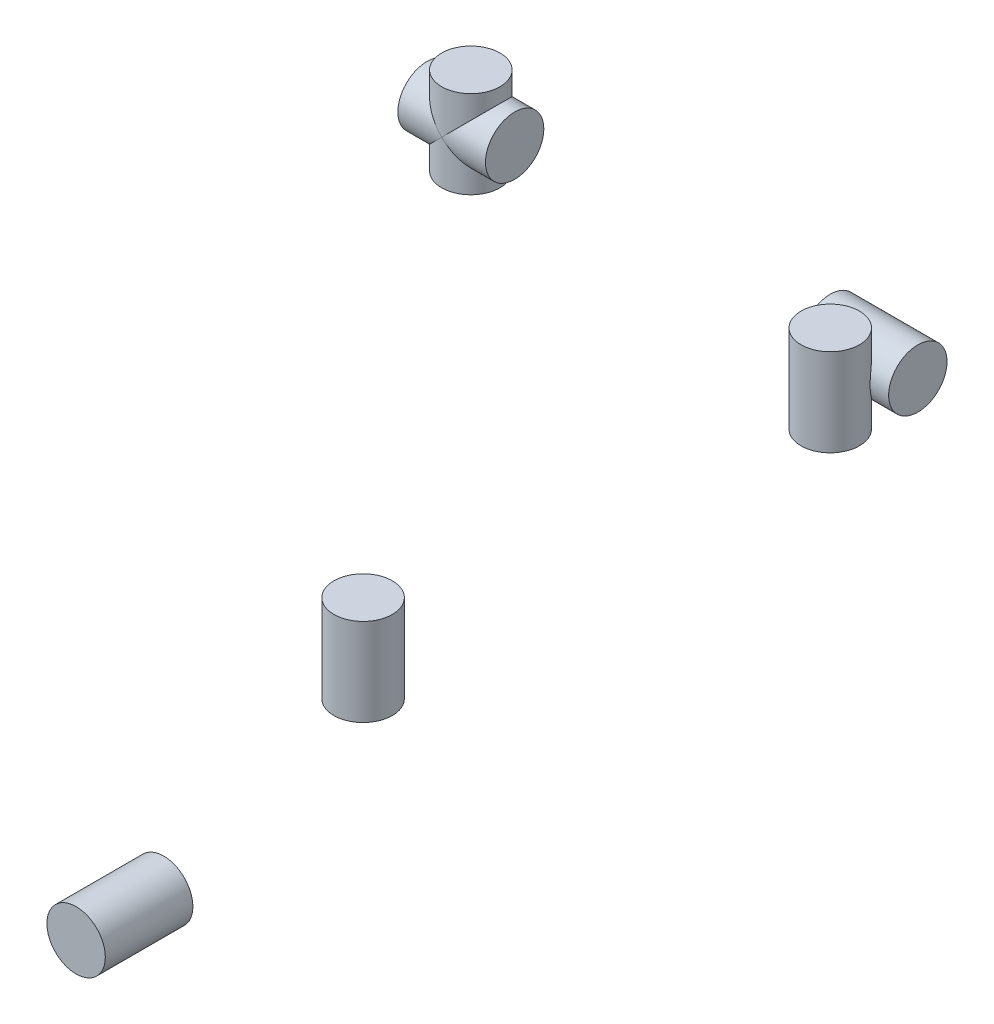
ISO-10303-21;
HEADER;
FILE_DESCRIPTION(('STEP AP214'),'2;1');
FILE_NAME('part.step','',(''),(''),'','','');
FILE_SCHEMA(('AUTOMOTIVE_DESIGN { 1 0 10303 214 1 1 1 1 }'));
ENDSEC;
DATA;
#1=APPLICATION_CONTEXT('core data for automotive mechanical design processes');
#2=APPLICATION_PROTOCOL_DEFINITION('international standard','automotive_design',2000,#1);
#3=PRODUCT_CONTEXT('',#1,'mechanical');
#4=PRODUCT('Part','Part','',(#3));
#5=PRODUCT_RELATED_PRODUCT_CATEGORY('part','',(#4));
#6=PRODUCT_DEFINITION_FORMATION('','',#4);
#7=PRODUCT_DEFINITION_CONTEXT('part definition',#1,'design');
#8=PRODUCT_DEFINITION('design','',#6,#7);
#9=PRODUCT_DEFINITION_SHAPE('','',#8);
#10=(LENGTH_UNIT() NAMED_UNIT(*) SI_UNIT(.MILLI.,.METRE.));
#11=(NAMED_UNIT(*) PLANE_ANGLE_UNIT() SI_UNIT($,.RADIAN.));
#12=(NAMED_UNIT(*) SI_UNIT($,.STERADIAN.) SOLID_ANGLE_UNIT());
#13=UNCERTAINTY_MEASURE_WITH_UNIT(LENGTH_MEASURE(1.E-05),#10,'distance_accuracy_value','');
#14=(GEOMETRIC_REPRESENTATION_CONTEXT(3) GLOBAL_UNCERTAINTY_ASSIGNED_CONTEXT((#13)) GLOBAL_UNIT_ASSIGNED_CONTEXT((#10,
#11,#12)) REPRESENTATION_CONTEXT('',''));
#15=CARTESIAN_POINT('',(0.,0.,0.));
#16=DIRECTION('',(0.,0.,1.));
#17=DIRECTION('',(1.,0.,0.));
#18=AXIS2_PLACEMENT_3D('',#15,#16,#17);
#19=CARTESIAN_POINT('',(-175.6,-15.,-310.8));
#20=DIRECTION('',(0.,1.,0.));
#21=DIRECTION('',(0.,0.,1.));
#22=AXIS2_PLACEMENT_3D('',#19,#20,#21);
#23=CYLINDRICAL_SURFACE('',#22,10.);
#24=CARTESIAN_POINT('',(-175.6,0.,-310.8));
#25=DIRECTION('',(0.707106781186547,0.707106781186547,0.));
#26=DIRECTION('',(-0.707106781186547,0.707106781186547,0.));
#27=AXIS2_PLACEMENT_3D('',#24,#25,#26);
#28=ELLIPSE('',#27,14.1421356237309,9.99999999999999);
#29=CARTESIAN_POINT('',(-175.6,0.,-300.8));
#30=VERTEX_POINT('',#29);
#31=CARTESIAN_POINT('',(-175.6,0.,-320.8));
#32=VERTEX_POINT('',#31);
#33=EDGE_CURVE('E58',#30,#32,#28,.T.);
#34=ORIENTED_EDGE('',*,*,#33,.F.);
#35=CARTESIAN_POINT('',(-175.6,0.,-310.8));
#36=DIRECTION('',(-0.707106781186547,0.707106781186547,0.));
#37=DIRECTION('',(0.707106781186547,0.707106781186547,0.));
#38=AXIS2_PLACEMENT_3D('',#35,#36,#37);
#39=ELLIPSE('',#38,14.1421356237309,9.99999999999999);
#40=EDGE_CURVE('E70',#32,#30,#39,.T.);
#41=ORIENTED_EDGE('',*,*,#40,.F.);
#42=EDGE_LOOP('',(#34,#41));
#43=FACE_BOUND('',#42,.T.);
#44=CARTESIAN_POINT('',(-175.6,-15.,-310.8));
#45=DIRECTION('',(0.,1.,0.));
#46=DIRECTION('',(0.,0.,1.));
#47=AXIS2_PLACEMENT_3D('',#44,#45,#46);
#48=CIRCLE('',#47,10.);
#49=CARTESIAN_POINT('',(-175.6,-15.,-300.8));
#50=VERTEX_POINT('',#49);
#51=EDGE_CURVE('E89',#50,#50,#48,.T.);
#52=ORIENTED_EDGE('',*,*,#51,.T.);
#53=EDGE_LOOP('',(#52));
#54=FACE_BOUND('',#53,.T.);
#55=ADVANCED_FACE('F50',(#43,#54),#23,.T.);
#56=CARTESIAN_POINT('',(-175.6,-15.,-310.8));
#57=DIRECTION('',(0.,1.,0.));
#58=DIRECTION('',(0.,0.,1.));
#59=AXIS2_PLACEMENT_3D('',#56,#57,#58);
#60=PLANE('',#59);
#61=ORIENTED_EDGE('',*,*,#51,.F.);
#62=EDGE_LOOP('',(#61));
#63=FACE_BOUND('',#62,.T.);
#64=ADVANCED_FACE('F106',(#63),#60,.F.);
#65=CARTESIAN_POINT('',(-160.6,0.,-310.8));
#66=DIRECTION('',(1.,0.,0.));
#67=DIRECTION('',(0.,0.,-1.));
#68=AXIS2_PLACEMENT_3D('',#65,#66,#67);
#69=PLANE('',#68);
#70=CARTESIAN_POINT('',(-160.6,0.,-310.8));
#71=DIRECTION('',(1.,0.,0.));
#72=DIRECTION('',(0.,0.,-1.));
#73=AXIS2_PLACEMENT_3D('',#70,#71,#72);
#74=CIRCLE('',#73,9.99999999999998);
#75=CARTESIAN_POINT('',(-160.6,0.,-320.8));
#76=VERTEX_POINT('',#75);
#77=EDGE_CURVE('E90',#76,#76,#74,.T.);
#78=ORIENTED_EDGE('',*,*,#77,.T.);
#79=EDGE_LOOP('',(#78));
#80=FACE_BOUND('',#79,.T.);
#81=ADVANCED_FACE('F110',(#80),#69,.T.);
#82=CARTESIAN_POINT('',(-190.6,0.,-310.8));
#83=DIRECTION('',(1.,0.,0.));
#84=DIRECTION('',(0.,0.,-1.));
#85=AXIS2_PLACEMENT_3D('',#82,#83,#84);
#86=CYLINDRICAL_SURFACE('',#85,9.99999999999998);
#87=ORIENTED_EDGE('',*,*,#77,.F.);
#88=EDGE_LOOP('',(#87));
#89=FACE_BOUND('',#88,.T.);
#90=CARTESIAN_POINT('',(-175.6,0.,-310.8));
#91=DIRECTION('',(-0.707106781186547,0.707106781186547,0.));
#92=DIRECTION('',(0.707106781186547,0.707106781186547,0.));
#93=AXIS2_PLACEMENT_3D('',#90,#91,#92);
#94=ELLIPSE('',#93,14.1421356237309,9.99999999999999);
#95=EDGE_CURVE('E64',#32,#30,#94,.F.);
#96=ORIENTED_EDGE('',*,*,#95,.T.);
#97=ORIENTED_EDGE('',*,*,#33,.T.);
#98=EDGE_LOOP('',(#96,#97));
#99=FACE_BOUND('',#98,.T.);
#100=ADVANCED_FACE('F79',(#89,#99),#86,.T.);
#101=CARTESIAN_POINT('',(-175.6,15.,-310.8));
#102=DIRECTION('',(0.,1.,0.));
#103=DIRECTION('',(0.,0.,1.));
#104=AXIS2_PLACEMENT_3D('',#101,#102,#103);
#105=PLANE('',#104);
#106=CARTESIAN_POINT('',(-175.6,15.,-310.8));
#107=DIRECTION('',(0.,1.,0.));
#108=DIRECTION('',(0.,0.,1.));
#109=AXIS2_PLACEMENT_3D('',#106,#107,#108);
#110=CIRCLE('',#109,10.);
#111=CARTESIAN_POINT('',(-175.6,15.,-300.8));
#112=VERTEX_POINT('',#111);
#113=EDGE_CURVE('E77',#112,#112,#110,.T.);
#114=ORIENTED_EDGE('',*,*,#113,.T.);
#115=EDGE_LOOP('',(#114));
#116=FACE_BOUND('',#115,.T.);
#117=ADVANCED_FACE('F52',(#116),#105,.T.);
#118=CARTESIAN_POINT('',(-175.6,0.,-310.8));
#119=DIRECTION('',(0.707106781186547,0.707106781186547,0.));
#120=DIRECTION('',(-0.707106781186547,0.707106781186547,0.));
#121=AXIS2_PLACEMENT_3D('',#118,#119,#120);
#122=ELLIPSE('',#121,14.1421356237309,9.99999999999999);
#123=EDGE_CURVE('E12',#30,#32,#122,.F.);
#124=ORIENTED_EDGE('',*,*,#123,.F.);
#125=ORIENTED_EDGE('',*,*,#95,.F.);
#126=EDGE_LOOP('',(#124,#125));
#127=FACE_BOUND('',#126,.T.);
#128=ORIENTED_EDGE('',*,*,#113,.F.);
#129=EDGE_LOOP('',(#128));
#130=FACE_BOUND('',#129,.T.);
#131=ADVANCED_FACE('F75',(#127,#130),#23,.T.);
#132=ORIENTED_EDGE('',*,*,#40,.T.);
#133=ORIENTED_EDGE('',*,*,#123,.T.);
#134=EDGE_LOOP('',(#132,#133));
#135=FACE_BOUND('',#134,.T.);
#136=CARTESIAN_POINT('',(-190.6,0.,-310.8));
#137=DIRECTION('',(1.,0.,0.));
#138=DIRECTION('',(0.,0.,-1.));
#139=AXIS2_PLACEMENT_3D('',#136,#137,#138);
#140=CIRCLE('',#139,9.99999999999998);
#141=CARTESIAN_POINT('',(-190.6,0.,-320.8));
#142=VERTEX_POINT('',#141);
#143=EDGE_CURVE('E87',#142,#142,#140,.T.);
#144=ORIENTED_EDGE('',*,*,#143,.T.);
#145=EDGE_LOOP('',(#144));
#146=FACE_BOUND('',#145,.T.);
#147=ADVANCED_FACE('F80',(#135,#146),#86,.T.);
#148=CARTESIAN_POINT('',(-190.6,0.,-310.8));
#149=DIRECTION('',(1.,0.,0.));
#150=DIRECTION('',(0.,0.,-1.));
#151=AXIS2_PLACEMENT_3D('',#148,#149,#150);
#152=PLANE('',#151);
#153=ORIENTED_EDGE('',*,*,#143,.F.);
#154=EDGE_LOOP('',(#153));
#155=FACE_BOUND('',#154,.T.);
#156=ADVANCED_FACE('F83',(#155),#152,.F.);
#157=CLOSED_SHELL('',(#55,#64,#81,#100,#117,#131,#147,#156));
#158=MANIFOLD_SOLID_BREP('B2',#157);
#159=CARTESIAN_POINT('',(-37.5,-15.,-295.8));
#160=DIRECTION('',(0.,1.,0.));
#161=DIRECTION('',(0.,0.,1.));
#162=AXIS2_PLACEMENT_3D('',#159,#160,#161);
#163=CYLINDRICAL_SURFACE('',#162,10.);
#164=CARTESIAN_POINT('',(-37.5,-8.66025403784436,-305.8));
#165=CARTESIAN_POINT('',(-37.7339230049075,-8.66025272050397,-305.800001345728));
#166=CARTESIAN_POINT('',(-37.9678254000365,-8.65552632143993,-305.791785374895));
#167=CARTESIAN_POINT('',(-38.4341657311689,-8.63648280066919,-305.759014630741));
#168=CARTESIAN_POINT('',(-38.6666032654161,-8.62216315436562,-305.734455556516));
#169=CARTESIAN_POINT('',(-39.1286690070044,-8.58351686023801,-305.669242406504));
#170=CARTESIAN_POINT('',(-39.3582933370168,-8.55917771872431,-305.628568238581));
#171=CARTESIAN_POINT('',(-39.8128233452028,-8.49986003102336,-305.531641004278));
#172=CARTESIAN_POINT('',(-40.0377293518527,-8.46488222811425,-305.475389026278));
#173=CARTESIAN_POINT('',(-40.4816949259291,-8.38335582886692,-305.347928998677));
#174=CARTESIAN_POINT('',(-40.7007401049489,-8.33678121675396,-305.276687378427));
#175=CARTESIAN_POINT('',(-41.1307566379394,-8.23110468231337,-305.120404211809));
#176=CARTESIAN_POINT('',(-41.3417278358337,-8.17200251796248,-305.03536239884));
#177=CARTESIAN_POINT('',(-41.7537044424931,-8.04025833414602,-304.852993904218));
#178=CARTESIAN_POINT('',(-41.9547177081432,-7.96762721168677,-304.755677129755));
#179=CARTESIAN_POINT('',(-42.3452618303735,-7.8077675591746,-304.550547216069));
#180=CARTESIAN_POINT('',(-42.5347934199239,-7.72053996227562,-304.44273474802));
#181=CARTESIAN_POINT('',(-42.8932090425681,-7.53456128770079,-304.223513901636));
#182=CARTESIAN_POINT('',(-43.0626233840807,-7.43643811182972,-304.112440065686));
#183=CARTESIAN_POINT('',(-43.3882546000434,-7.22546781356393,-303.885041246825));
#184=CARTESIAN_POINT('',(-43.5444718627111,-7.11262112453864,-303.768716418538));
#185=CARTESIAN_POINT('',(-43.8427191201456,-6.87206591762845,-303.533433101581));
#186=CARTESIAN_POINT('',(-43.9847544304312,-6.74436300713533,-303.414475620231));
#187=CARTESIAN_POINT('',(-44.254116586128,-6.4742653208274,-303.176598197734));
#188=CARTESIAN_POINT('',(-44.3814441551966,-6.3318712685064,-303.057678255027));
#189=CARTESIAN_POINT('',(-44.6123435466863,-6.04403535742714,-302.831270502152));
#190=CARTESIAN_POINT('',(-44.716975275097,-5.89959500597967,-302.723586955216));
#191=CARTESIAN_POINT('',(-44.9136066939399,-5.59936992729039,-302.512617474542));
#192=CARTESIAN_POINT('',(-45.0056070633257,-5.44358581048167,-302.409331304644));
#193=CARTESIAN_POINT('',(-45.1773867069789,-5.12157403202801,-302.208990406547));
#194=CARTESIAN_POINT('',(-45.2571632419013,-4.95534404121154,-302.111937077943));
#195=CARTESIAN_POINT('',(-45.4050518241694,-4.61354802854454,-301.925708166565));
#196=CARTESIAN_POINT('',(-45.4731634101421,-4.43798163777962,-301.836532895453));
#197=CARTESIAN_POINT('',(-45.5997910060612,-4.07473086795931,-301.665573723609));
#198=CARTESIAN_POINT('',(-45.6580632954663,-3.88686498890024,-301.583995281056));
#199=CARTESIAN_POINT('',(-45.7639403354064,-3.50388101323964,-301.43168677257));
#200=CARTESIAN_POINT('',(-45.8115450181917,-3.30876287058835,-301.360956775536));
#201=CARTESIAN_POINT('',(-45.8968732704893,-2.91249532380806,-301.231256754626));
#202=CARTESIAN_POINT('',(-45.9345941540546,-2.71134429674413,-301.172289928457));
#203=CARTESIAN_POINT('',(-46.0008381325733,-2.30431086989732,-301.066842238457));
#204=CARTESIAN_POINT('',(-46.0293607784339,-2.09842823962525,-301.020361984286));
#205=CARTESIAN_POINT('',(-46.0798432407944,-1.66554390750987,-300.937010041516));
#206=CARTESIAN_POINT('',(-46.1010417544487,-1.43823141623587,-300.901286890378));
#207=CARTESIAN_POINT('',(-46.1338447383416,-0.980998847598446,-300.845569153776));
#208=CARTESIAN_POINT('',(-46.1454487179724,-0.751078637501008,-300.825575372622));
#209=CARTESIAN_POINT('',(-46.1593752352375,-0.290040943514111,-300.801541259551));
#210=CARTESIAN_POINT('',(-46.161694363079,-0.0589230509780367,-300.797506788579));
#211=CARTESIAN_POINT('',(-46.1571049755177,0.402947281533959,-300.805452247095));
#212=CARTESIAN_POINT('',(-46.1501962845222,0.63369971447203,-300.81743248132));
#213=CARTESIAN_POINT('',(-46.126383146783,1.10484829089289,-300.858271226891));
#214=CARTESIAN_POINT('',(-46.1089965657517,1.34515028950072,-300.887943058158));
#215=CARTESIAN_POINT('',(-46.0633392470013,1.82197916296547,-300.964416803553));
#216=CARTESIAN_POINT('',(-46.035068047335,2.05850587715414,-301.011219444715));
#217=CARTESIAN_POINT('',(-45.9668687614415,2.52598227549846,-301.121308494536));
#218=CARTESIAN_POINT('',(-45.9269409336852,2.75693208319202,-301.184594537692));
#219=CARTESIAN_POINT('',(-45.8344369339235,3.21140813527477,-301.32669374471));
#220=CARTESIAN_POINT('',(-45.7818612724379,3.43493467888391,-301.405506281834));
#221=CARTESIAN_POINT('',(-45.664175699868,3.86808035141751,-301.575525003922));
#222=CARTESIAN_POINT('',(-45.5993524454655,4.07789303789492,-301.666435897969));
#223=CARTESIAN_POINT('',(-45.4553900218682,4.48682645387963,-301.860225173449));
#224=CARTESIAN_POINT('',(-45.3762510003086,4.68594729362204,-301.963103431461));
#225=CARTESIAN_POINT('',(-45.2027137731209,5.07161454595842,-302.178661062545));
#226=CARTESIAN_POINT('',(-45.1083285819945,5.25817149263092,-302.291332038751));
#227=CARTESIAN_POINT('',(-44.9034604251157,5.61732540437465,-302.524045020968));
#228=CARTESIAN_POINT('',(-44.7929790200805,5.78992372037888,-302.644086311686));
#229=CARTESIAN_POINT('',(-44.5653234287948,6.10621603101423,-302.878533809271));
#230=CARTESIAN_POINT('',(-44.4494606642816,6.25111999464351,-302.992583721724));
#231=CARTESIAN_POINT('',(-44.2038239918847,6.52740963722448,-303.222060239159));
#232=CARTESIAN_POINT('',(-44.0740509124941,6.65879612035963,-303.337486761787));
#233=CARTESIAN_POINT('',(-43.8009445940581,6.90766180711926,-303.567234428351));
#234=CARTESIAN_POINT('',(-43.6576127527879,7.02514244149509,-303.681555684892));
#235=CARTESIAN_POINT('',(-43.3580457799208,7.24618185436346,-303.906688434725));
#236=CARTESIAN_POINT('',(-43.2018107330227,7.34974072422917,-304.017499951048));
#237=CARTESIAN_POINT('',(-42.8851687575964,7.53859137126236,-304.228189342588));
#238=CARTESIAN_POINT('',(-42.7253199197729,7.62452044420666,-304.328336688668));
#239=CARTESIAN_POINT('',(-42.3957947489366,7.78449956203914,-304.521678901559));
#240=CARTESIAN_POINT('',(-42.2261187997451,7.85855007044751,-304.614874039581));
#241=CARTESIAN_POINT('',(-41.8779983564331,7.99542159007013,-304.792850430731));
#242=CARTESIAN_POINT('',(-41.6995516072528,8.05823969386263,-304.877629502906));
#243=CARTESIAN_POINT('',(-41.3350892563678,8.17333970856684,-305.037515765242));
#244=CARTESIAN_POINT('',(-41.1490732732266,8.22562108770882,-305.112622467186));
#245=CARTESIAN_POINT('',(-40.759970683345,8.32305277618827,-305.256107931025));
#246=CARTESIAN_POINT('',(-40.5565131955046,8.36763394791899,-305.323867578633));
#247=CARTESIAN_POINT('',(-40.1438538419111,8.44666520804767,-305.446573617107));
#248=CARTESIAN_POINT('',(-39.9346518111309,8.48111500506159,-305.501519639436));
#249=CARTESIAN_POINT('',(-39.5117880593158,8.54060009031652,-305.597946314622));
#250=CARTESIAN_POINT('',(-39.2981249876896,8.56563248247846,-305.639422824743));
#251=CARTESIAN_POINT('',(-38.867712958196,8.60682696627153,-305.70842440226));
#252=CARTESIAN_POINT('',(-38.6509638744144,8.62298869489505,-305.735948898705));
#253=CARTESIAN_POINT('',(-38.1980845445137,8.64778622796511,-305.77840095217));
#254=CARTESIAN_POINT('',(-37.9618021204518,8.65570923876767,-305.792132349482));
#255=CARTESIAN_POINT('',(-37.4887256090772,8.661867778497,-305.802792625764));
#256=CARTESIAN_POINT('',(-37.2519314951735,8.66010279124599,-305.799720609446));
#257=CARTESIAN_POINT('',(-36.779346665121,8.64683114966977,-305.776805064483));
#258=CARTESIAN_POINT('',(-36.5435563137693,8.63532121461572,-305.756955887652));
#259=CARTESIAN_POINT('',(-36.0746672016468,8.60223036724155,-305.700716200926));
#260=CARTESIAN_POINT('',(-35.8415684471313,8.58064943152102,-305.664325652596));
#261=CARTESIAN_POINT('',(-35.3736903450363,8.52613298092633,-305.574303904359));
#262=CARTESIAN_POINT('',(-35.139024803484,8.49291690756839,-305.520249155313));
#263=CARTESIAN_POINT('',(-34.6760645877623,8.4143902930732,-305.395979823944));
#264=CARTESIAN_POINT('',(-34.4477700978479,8.36907940254529,-305.325764774795));
#265=CARTESIAN_POINT('',(-33.9995193154378,8.26531405255152,-305.170319051776));
#266=CARTESIAN_POINT('',(-33.7795597636896,8.20686479393958,-305.085094322405));
#267=CARTESIAN_POINT('',(-33.3497975381789,8.07564267448487,-304.901122893773));
#268=CARTESIAN_POINT('',(-33.1399941461838,8.00287082836908,-304.8023771526));
#269=CARTESIAN_POINT('',(-32.7421498158752,7.84569540581204,-304.598320024501));
#270=CARTESIAN_POINT('',(-32.5535481211911,7.76201278292608,-304.493546961413));
#271=CARTESIAN_POINT('',(-32.1887835260794,7.57974992715258,-304.275618422095));
#272=CARTESIAN_POINT('',(-32.0126201950716,7.48117021033091,-304.162463236308));
#273=CARTESIAN_POINT('',(-31.6742022893101,7.26858199208275,-303.930323505587));
#274=CARTESIAN_POINT('',(-31.5119376696881,7.15458478949521,-303.811343269953));
#275=CARTESIAN_POINT('',(-31.2022369683836,6.9108600323997,-303.57024395007));
#276=CARTESIAN_POINT('',(-31.0547997687636,6.78113366544697,-303.448125103334));
#277=CARTESIAN_POINT('',(-30.7873515232728,6.51787985758211,-303.214121209191));
#278=CARTESIAN_POINT('',(-30.6660736948783,6.3856216696194,-303.102252224595));
#279=CARTESIAN_POINT('',(-30.4366740883947,6.10856230377373,-302.880598008506));
#280=CARTESIAN_POINT('',(-30.3285515015063,5.96376189793863,-302.770812649261));
#281=CARTESIAN_POINT('',(-30.1253380135851,5.66232632004536,-302.555463967687));
#282=CARTESIAN_POINT('',(-30.0302491129528,5.5056893370284,-302.449901295209));
#283=CARTESIAN_POINT('',(-29.8527433422361,5.18155431421262,-302.244986367407));
#284=CARTESIAN_POINT('',(-29.7703267791611,5.01405601141938,-302.145634262578));
#285=CARTESIAN_POINT('',(-29.61831925828,4.67097774181715,-301.955790803771));
#286=CARTESIAN_POINT('',(-29.5486126647635,4.49549090156896,-301.86522347769));
#287=CARTESIAN_POINT('',(-29.4203628889269,4.13614172519379,-301.693298805767));
#288=CARTESIAN_POINT('',(-29.3618195476845,3.95227950834653,-301.611941328818));
#289=CARTESIAN_POINT('',(-29.255129235387,3.57734236402686,-301.459572643903));
#290=CARTESIAN_POINT('',(-29.206984912435,3.38626561389705,-301.388564072774));
#291=CARTESIAN_POINT('',(-29.120367299359,2.99815382571509,-301.257829715742));
#292=CARTESIAN_POINT('',(-29.081894512448,2.80111847823262,-301.198104516958));
#293=CARTESIAN_POINT('',(-29.0112819421318,2.38667225850145,-301.086433087113));
#294=CARTESIAN_POINT('',(-28.9798734754784,2.16887362036716,-301.035461521952));
#295=CARTESIAN_POINT('',(-28.926799727248,1.7292052164569,-300.948091771705));
#296=CARTESIAN_POINT('',(-28.9051348780934,1.50733527045071,-300.911694233424));
#297=CARTESIAN_POINT('',(-28.8710145500088,1.06087324480816,-300.853883540738));
#298=CARTESIAN_POINT('',(-28.8585623040001,0.836280237659802,-300.832475646696));
#299=CARTESIAN_POINT('',(-28.8425616959292,0.385844012678835,-300.80489896692));
#300=CARTESIAN_POINT('',(-28.8390135987042,0.160000757860174,-300.798730634457));
#301=CARTESIAN_POINT('',(-28.8407848300795,-0.306487107361437,-300.801800291783));
#302=CARTESIAN_POINT('',(-28.8467057046679,-0.547123481090264,-300.812083428211));
#303=CARTESIAN_POINT('',(-28.8687356415912,-1.02657560470252,-300.849925921081));
#304=CARTESIAN_POINT('',(-28.8848452057615,-1.26539126432179,-300.87748612849));
#305=CARTESIAN_POINT('',(-28.9277209214889,-1.73953928261719,-300.949542612539));
#306=CARTESIAN_POINT('',(-28.9544891041283,-1.97487096852518,-300.994042117023));
#307=CARTESIAN_POINT('',(-29.0194090728331,-2.44025354433115,-301.099377569241));
#308=CARTESIAN_POINT('',(-29.0575606401045,-2.67030453563497,-301.160213202986));
#309=CARTESIAN_POINT('',(-29.1461963189732,-3.12333889800753,-301.297328862791));
#310=CARTESIAN_POINT('',(-29.1966807219318,-3.34632210196023,-301.373609253724));
#311=CARTESIAN_POINT('',(-29.31108169894,-3.78337524172568,-301.540368810418));
#312=CARTESIAN_POINT('',(-29.3749983935535,-3.99744509751437,-301.630848103622));
#313=CARTESIAN_POINT('',(-29.5173640766211,-4.41466217181216,-301.824277928142));
#314=CARTESIAN_POINT('',(-29.5958025516057,-4.61781715604516,-301.927219418542));
#315=CARTESIAN_POINT('',(-29.7683164590508,-5.01155772001925,-302.143515351581));
#316=CARTESIAN_POINT('',(-29.8623904178079,-5.20214448200034,-302.256868812404));
#317=CARTESIAN_POINT('',(-30.0597758623762,-5.55610510290199,-302.483110399978));
#318=CARTESIAN_POINT('',(-30.1619609317574,-5.72045030068174,-302.595462691436));
#319=CARTESIAN_POINT('',(-30.3809771004374,-6.03577031129951,-302.824572014275));
#320=CARTESIAN_POINT('',(-30.4978074398021,-6.18674581718951,-302.941328816887));
#321=CARTESIAN_POINT('',(-30.746123741549,-6.47444710604032,-303.176610798348));
#322=CARTESIAN_POINT('',(-30.8776031029407,-6.61117925388121,-303.29513516003));
#323=CARTESIAN_POINT('',(-31.1549407319873,-6.87001180872867,-303.531324724518));
#324=CARTESIAN_POINT('',(-31.3007984519936,-6.99211277262139,-303.648989959862));
#325=CARTESIAN_POINT('',(-31.5953889352225,-7.21349441859743,-303.872627506094));
#326=CARTESIAN_POINT('',(-31.7431893304017,-7.31377818222637,-303.978838351056));
#327=CARTESIAN_POINT('',(-32.0497957136244,-7.50187864668271,-304.18627003306));
#328=CARTESIAN_POINT('',(-32.2086011564633,-7.58969596445813,-304.287491116877));
#329=CARTESIAN_POINT('',(-32.5363214843966,-7.75336102091788,-304.48322198333));
#330=CARTESIAN_POINT('',(-32.7052415649646,-7.82920253410629,-304.577728261397));
#331=CARTESIAN_POINT('',(-33.0520140055885,-7.96948217600836,-304.758440304904));
#332=CARTESIAN_POINT('',(-33.2298666230421,-8.03391997587317,-304.844645830944));
#333=CARTESIAN_POINT('',(-33.5989113764543,-8.15391710914246,-305.009974632477));
#334=CARTESIAN_POINT('',(-33.7903453678725,-8.20914337179983,-305.088799456937));
#335=CARTESIAN_POINT('',(-34.1801622768809,-8.30904830970512,-305.235148770637));
#336=CARTESIAN_POINT('',(-34.3785456877564,-8.3537262344591,-305.302672455724));
#337=CARTESIAN_POINT('',(-34.7808109955109,-8.43327204935607,-305.425497495274));
#338=CARTESIAN_POINT('',(-34.9846887074303,-8.46814718698329,-305.480807872869));
#339=CARTESIAN_POINT('',(-35.3967634503603,-8.52879863740412,-305.578611846735));
#340=CARTESIAN_POINT('',(-35.6049596756509,-8.55457663160094,-305.621107811252));
#341=CARTESIAN_POINT('',(-36.0919503164424,-8.60451088943874,-305.704364269852));
#342=CARTESIAN_POINT('',(-36.3719343349395,-8.62548472322001,-305.740179806104));
#343=CARTESIAN_POINT('',(-36.9346221762054,-8.6533574491632,-305.787997460064));
#344=CARTESIAN_POINT('',(-37.2173261357558,-8.66025562972585,-305.799998373815));
#345=CARTESIAN_POINT('',(-37.5,-8.66025403784436,-305.8));
#346=B_SPLINE_CURVE_WITH_KNOTS('',3,(#164,#165,#166,#167,#168,#169,#170,#171,#172,#173,#174,
#175,#176,#177,#178,#179,#180,#181,#182,#183,#184,#185,#186,#187,#188,#189,#190,#191,#192,#193,
#194,#195,#196,#197,#198,#199,#200,#201,#202,#203,#204,#205,#206,#207,#208,#209,#210,#211,#212,
#213,#214,#215,#216,#217,#218,#219,#220,#221,#222,#223,#224,#225,#226,#227,#228,#229,#230,#231,
#232,#233,#234,#235,#236,#237,#238,#239,#240,#241,#242,#243,#244,#245,#246,#247,#248,#249,#250,
#251,#252,#253,#254,#255,#256,#257,#258,#259,#260,#261,#262,#263,#264,#265,#266,#267,#268,#269,
#270,#271,#272,#273,#274,#275,#276,#277,#278,#279,#280,#281,#282,#283,#284,#285,#286,#287,#288,
#289,#290,#291,#292,#293,#294,#295,#296,#297,#298,#299,#300,#301,#302,#303,#304,#305,#306,#307,
#308,#309,#310,#311,#312,#313,#314,#315,#316,#317,#318,#319,#320,#321,#322,#323,#324,#325,#326,
#327,#328,#329,#330,#331,#332,#333,#334,#335,#336,#337,#338,#339,#340,#341,#342,#343,#344,#345),
.UNSPECIFIED.,.T.,.F.,(4,2,2,2,2,2,2,2,2,2,2,2,2,2,2,2,2,2,2,2,2,2,2,2,2,2,2,2,2,2,2,2,2,2,2,2,
2,2,2,2,2,2,2,2,2,2,2,2,2,2,2,2,2,2,2,2,2,2,2,2,2,2,2,2,2,2,2,2,2,2,2,2,2,2,2,2,2,2,2,2,2,2,2,2,
2,2,2,2,2,2,4),(0.,0.701541035046407,1.4032667629641,2.10587016263988,2.80842448566847,
3.51256931682717,4.21672775279539,4.9203214522645,5.62387018809759,6.2982422910378,
6.97259454909802,7.6466930977478,8.32075846493688,8.94504872613137,9.56930541767854,
10.1937018003542,10.8181228735123,11.4562639446069,12.0944090684044,12.7327274302973,
13.3710769525882,14.0635398909172,14.7560382355196,15.4487908716835,16.1415566901754,
16.8689323768135,17.596338936949,18.3237293689908,19.0510904454099,19.7631645278506,
20.4752312672534,21.1866933504742,21.8980864949369,22.5505815079117,23.2030376801053,
23.8554266636293,24.5078113650983,25.1289539872014,25.7500723654479,26.3713512834198,
26.9926615483851,27.6490442411784,28.305445810062,28.9620490735709,29.6186792047676,
30.3283122462204,31.0379830973794,31.7478929609868,32.4578044741082,33.1861687009547,
33.9145539707982,34.6426514138048,35.3706972911051,36.0639941000604,36.7572668972962,
37.4500343491625,38.1427495294707,38.7763461769883,39.4099038505556,40.0435586534617,
40.6772288053267,41.3048097823668,41.9323818243699,42.560113489252,43.1878778084432,
43.8647742357127,44.5417007007296,45.2188646027932,45.896048645591,46.6179877907536,
47.3399624971962,48.0620748474061,48.7841733191811,49.5062888520731,50.2284108667231,
50.9500121099763,51.6715453781137,52.3419672075172,53.0123542635315,53.6824404491632,
54.352501122141,54.975187532273,55.5978431157219,56.220821322037,56.8438174902475,
57.4859284683007,58.1280851175562,58.7697657454965,59.4113277109533,60.2590309569195,
61.1067770577397),.UNSPECIFIED.);
#347=CARTESIAN_POINT('',(-37.5,-8.66025403784436,-305.8));
#348=VERTEX_POINT('',#347);
#349=EDGE_CURVE('E49',#348,#348,#346,.T.);
#350=ORIENTED_EDGE('',*,*,#349,.F.);
#351=EDGE_LOOP('',(#350));
#352=FACE_BOUND('',#351,.T.);
#353=CARTESIAN_POINT('',(-37.5,-15.,-295.8));
#354=DIRECTION('',(0.,1.,0.));
#355=DIRECTION('',(0.,0.,1.));
#356=AXIS2_PLACEMENT_3D('',#353,#354,#355);
#357=CIRCLE('',#356,10.);
#358=CARTESIAN_POINT('',(-37.5,-15.,-285.8));
#359=VERTEX_POINT('',#358);
#360=EDGE_CURVE('E208',#359,#359,#357,.T.);
#361=ORIENTED_EDGE('',*,*,#360,.T.);
#362=EDGE_LOOP('',(#361));
#363=FACE_BOUND('',#362,.T.);
#364=CARTESIAN_POINT('',(-37.5,15.,-295.8));
#365=DIRECTION('',(0.,1.,0.));
#366=DIRECTION('',(0.,0.,1.));
#367=AXIS2_PLACEMENT_3D('',#364,#365,#366);
#368=CIRCLE('',#367,10.);
#369=CARTESIAN_POINT('',(-37.5,15.,-285.8));
#370=VERTEX_POINT('',#369);
#371=EDGE_CURVE('E204',#370,#370,#368,.T.);
#372=ORIENTED_EDGE('',*,*,#371,.F.);
#373=EDGE_LOOP('',(#372));
#374=FACE_BOUND('',#373,.T.);
#375=ADVANCED_FACE('F192',(#352,#363,#374),#163,.T.);
#376=CARTESIAN_POINT('',(-37.5,-15.,-295.8));
#377=DIRECTION('',(0.,1.,0.));
#378=DIRECTION('',(0.,0.,1.));
#379=AXIS2_PLACEMENT_3D('',#376,#377,#378);
#380=PLANE('',#379);
#381=ORIENTED_EDGE('',*,*,#360,.F.);
#382=EDGE_LOOP('',(#381));
#383=FACE_BOUND('',#382,.T.);
#384=ADVANCED_FACE('F232',(#383),#380,.F.);
#385=CARTESIAN_POINT('',(-37.5,15.,-295.8));
#386=DIRECTION('',(0.,1.,0.));
#387=DIRECTION('',(0.,0.,1.));
#388=AXIS2_PLACEMENT_3D('',#385,#386,#387);
#389=PLANE('',#388);
#390=ORIENTED_EDGE('',*,*,#371,.T.);
#391=EDGE_LOOP('',(#390));
#392=FACE_BOUND('',#391,.T.);
#393=ADVANCED_FACE('F194',(#392),#389,.T.);
#394=CARTESIAN_POINT('',(-52.5,0.,-310.8));
#395=DIRECTION('',(1.,0.,0.));
#396=DIRECTION('',(0.,0.,-1.));
#397=AXIS2_PLACEMENT_3D('',#394,#395,#396);
#398=CYLINDRICAL_SURFACE('',#397,9.99999999999998);
#399=ORIENTED_EDGE('',*,*,#349,.T.);
#400=EDGE_LOOP('',(#399));
#401=FACE_BOUND('',#400,.T.);
#402=CARTESIAN_POINT('',(-52.5,0.,-310.8));
#403=DIRECTION('',(1.,0.,0.));
#404=DIRECTION('',(0.,0.,-1.));
#405=AXIS2_PLACEMENT_3D('',#402,#403,#404);
#406=CIRCLE('',#405,9.99999999999998);
#407=CARTESIAN_POINT('',(-52.5,0.,-320.8));
#408=VERTEX_POINT('',#407);
#409=EDGE_CURVE('E212',#408,#408,#406,.T.);
#410=ORIENTED_EDGE('',*,*,#409,.T.);
#411=EDGE_LOOP('',(#410));
#412=FACE_BOUND('',#411,.T.);
#413=CARTESIAN_POINT('',(-22.5,0.,-310.8));
#414=DIRECTION('',(1.,0.,0.));
#415=DIRECTION('',(0.,0.,-1.));
#416=AXIS2_PLACEMENT_3D('',#413,#414,#415);
#417=CIRCLE('',#416,9.99999999999998);
#418=CARTESIAN_POINT('',(-22.5,0.,-320.8));
#419=VERTEX_POINT('',#418);
#420=EDGE_CURVE('E217',#419,#419,#417,.T.);
#421=ORIENTED_EDGE('',*,*,#420,.F.);
#422=EDGE_LOOP('',(#421));
#423=FACE_BOUND('',#422,.T.);
#424=ADVANCED_FACE('F223',(#401,#412,#423),#398,.T.);
#425=CARTESIAN_POINT('',(-52.5,0.,-310.8));
#426=DIRECTION('',(1.,0.,0.));
#427=DIRECTION('',(0.,0.,-1.));
#428=AXIS2_PLACEMENT_3D('',#425,#426,#427);
#429=PLANE('',#428);
#430=ORIENTED_EDGE('',*,*,#409,.F.);
#431=EDGE_LOOP('',(#430));
#432=FACE_BOUND('',#431,.T.);
#433=ADVANCED_FACE('F225',(#432),#429,.F.);
#434=CARTESIAN_POINT('',(-22.5,0.,-310.8));
#435=DIRECTION('',(1.,0.,0.));
#436=DIRECTION('',(0.,0.,-1.));
#437=AXIS2_PLACEMENT_3D('',#434,#435,#436);
#438=PLANE('',#437);
#439=ORIENTED_EDGE('',*,*,#420,.T.);
#440=EDGE_LOOP('',(#439));
#441=FACE_BOUND('',#440,.T.);
#442=ADVANCED_FACE('F221',(#441),#438,.T.);
#443=CLOSED_SHELL('',(#375,#384,#393,#424,#433,#442));
#444=MANIFOLD_SOLID_BREP('B6',#443);
#445=CARTESIAN_POINT('',(-37.5,-15.,-135.8));
#446=DIRECTION('',(0.,1.,0.));
#447=DIRECTION('',(0.,0.,1.));
#448=AXIS2_PLACEMENT_3D('',#445,#446,#447);
#449=CYLINDRICAL_SURFACE('',#448,10.);
#450=CARTESIAN_POINT('',(-37.5,-15.,-135.8));
#451=DIRECTION('',(0.,1.,0.));
#452=DIRECTION('',(0.,0.,1.));
#453=AXIS2_PLACEMENT_3D('',#450,#451,#452);
#454=CIRCLE('',#453,10.);
#455=CARTESIAN_POINT('',(-37.5,-15.,-125.8));
#456=VERTEX_POINT('',#455);
#457=EDGE_CURVE('E191',#456,#456,#454,.T.);
#458=ORIENTED_EDGE('',*,*,#457,.T.);
#459=EDGE_LOOP('',(#458));
#460=FACE_BOUND('',#459,.T.);
#461=CARTESIAN_POINT('',(-37.5,15.,-135.8));
#462=DIRECTION('',(0.,1.,0.));
#463=DIRECTION('',(0.,0.,1.));
#464=AXIS2_PLACEMENT_3D('',#461,#462,#463);
#465=CIRCLE('',#464,10.);
#466=CARTESIAN_POINT('',(-37.5,15.,-125.8));
#467=VERTEX_POINT('',#466);
#468=EDGE_CURVE('E308',#467,#467,#465,.T.);
#469=ORIENTED_EDGE('',*,*,#468,.F.);
#470=EDGE_LOOP('',(#469));
#471=FACE_BOUND('',#470,.T.);
#472=ADVANCED_FACE('F302',(#460,#471),#449,.T.);
#473=CARTESIAN_POINT('',(-37.5,-15.,-135.8));
#474=DIRECTION('',(0.,1.,0.));
#475=DIRECTION('',(0.,0.,1.));
#476=AXIS2_PLACEMENT_3D('',#473,#474,#475);
#477=PLANE('',#476);
#478=ORIENTED_EDGE('',*,*,#457,.F.);
#479=EDGE_LOOP('',(#478));
#480=FACE_BOUND('',#479,.T.);
#481=ADVANCED_FACE('F317',(#480),#477,.F.);
#482=CARTESIAN_POINT('',(-37.5,15.,-135.8));
#483=DIRECTION('',(0.,1.,0.));
#484=DIRECTION('',(0.,0.,1.));
#485=AXIS2_PLACEMENT_3D('',#482,#483,#484);
#486=PLANE('',#485);
#487=ORIENTED_EDGE('',*,*,#468,.T.);
#488=EDGE_LOOP('',(#487));
#489=FACE_BOUND('',#488,.T.);
#490=ADVANCED_FACE('F314',(#489),#486,.T.);
#491=CLOSED_SHELL('',(#472,#481,#490));
#492=MANIFOLD_SOLID_BREP('B44',#491);
#493=CARTESIAN_POINT('',(0.,0.,-30.));
#494=DIRECTION('',(0.,0.,1.));
#495=DIRECTION('',(1.,0.,0.));
#496=AXIS2_PLACEMENT_3D('',#493,#494,#495);
#497=CYLINDRICAL_SURFACE('',#496,10.);
#498=CARTESIAN_POINT('',(0.,0.,-30.));
#499=DIRECTION('',(0.,0.,1.));
#500=DIRECTION('',(1.,0.,0.));
#501=AXIS2_PLACEMENT_3D('',#498,#499,#500);
#502=CIRCLE('',#501,10.);
#503=CARTESIAN_POINT('',(10.,0.,-30.));
#504=VERTEX_POINT('',#503);
#505=EDGE_CURVE('E301',#504,#504,#502,.T.);
#506=ORIENTED_EDGE('',*,*,#505,.T.);
#507=EDGE_LOOP('',(#506));
#508=FACE_BOUND('',#507,.T.);
#509=CARTESIAN_POINT('',(0.,0.,0.));
#510=DIRECTION('',(0.,0.,1.));
#511=DIRECTION('',(1.,0.,0.));
#512=AXIS2_PLACEMENT_3D('',#509,#510,#511);
#513=CIRCLE('',#512,10.);
#514=CARTESIAN_POINT('',(10.,0.,0.));
#515=VERTEX_POINT('',#514);
#516=EDGE_CURVE('E352',#515,#515,#513,.T.);
#517=ORIENTED_EDGE('',*,*,#516,.F.);
#518=EDGE_LOOP('',(#517));
#519=FACE_BOUND('',#518,.T.);
#520=ADVANCED_FACE('F349',(#508,#519),#497,.T.);
#521=CARTESIAN_POINT('',(0.,0.,-30.));
#522=DIRECTION('',(0.,0.,1.));
#523=DIRECTION('',(1.,0.,0.));
#524=AXIS2_PLACEMENT_3D('',#521,#522,#523);
#525=PLANE('',#524);
#526=ORIENTED_EDGE('',*,*,#505,.F.);
#527=EDGE_LOOP('',(#526));
#528=FACE_BOUND('',#527,.T.);
#529=ADVANCED_FACE('F364',(#528),#525,.F.);
#530=CARTESIAN_POINT('',(0.,0.,0.));
#531=DIRECTION('',(0.,0.,1.));
#532=DIRECTION('',(1.,0.,0.));
#533=AXIS2_PLACEMENT_3D('',#530,#531,#532);
#534=PLANE('',#533);
#535=ORIENTED_EDGE('',*,*,#516,.T.);
#536=EDGE_LOOP('',(#535));
#537=FACE_BOUND('',#536,.T.);
#538=ADVANCED_FACE('F361',(#537),#534,.T.);
#539=CLOSED_SHELL('',(#520,#529,#538));
#540=MANIFOLD_SOLID_BREP('B186',#539);
#541=ADVANCED_BREP_SHAPE_REPRESENTATION('',(#18,#158,#444,#492,#540),#14);
#542=SHAPE_DEFINITION_REPRESENTATION(#9,#541);
ENDSEC;
END-ISO-10303-21;
